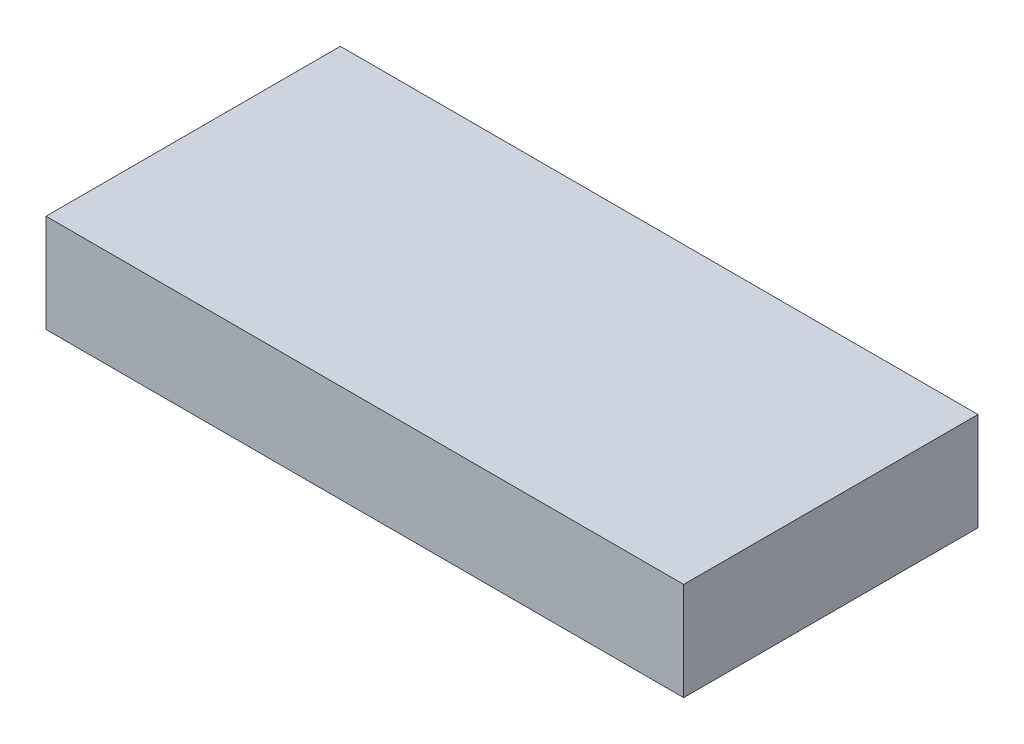
ISO-10303-21;
HEADER;
FILE_DESCRIPTION(('STEP AP214'),'2;1');
FILE_NAME('part.step','',(''),(''),'','','');
FILE_SCHEMA(('AUTOMOTIVE_DESIGN { 1 0 10303 214 1 1 1 1 }'));
ENDSEC;
DATA;
#1=APPLICATION_CONTEXT('core data for automotive mechanical design processes');
#2=APPLICATION_PROTOCOL_DEFINITION('international standard','automotive_design',2000,#1);
#3=PRODUCT_CONTEXT('',#1,'mechanical');
#4=PRODUCT('Part','Part','',(#3));
#5=PRODUCT_RELATED_PRODUCT_CATEGORY('part','',(#4));
#6=PRODUCT_DEFINITION_FORMATION('','',#4);
#7=PRODUCT_DEFINITION_CONTEXT('part definition',#1,'design');
#8=PRODUCT_DEFINITION('design','',#6,#7);
#9=PRODUCT_DEFINITION_SHAPE('','',#8);
#10=(LENGTH_UNIT() NAMED_UNIT(*) SI_UNIT(.MILLI.,.METRE.));
#11=(NAMED_UNIT(*) PLANE_ANGLE_UNIT() SI_UNIT($,.RADIAN.));
#12=(NAMED_UNIT(*) SI_UNIT($,.STERADIAN.) SOLID_ANGLE_UNIT());
#13=UNCERTAINTY_MEASURE_WITH_UNIT(LENGTH_MEASURE(1.E-05),#10,'distance_accuracy_value','');
#14=(GEOMETRIC_REPRESENTATION_CONTEXT(3) GLOBAL_UNCERTAINTY_ASSIGNED_CONTEXT((#13)) GLOBAL_UNIT_ASSIGNED_CONTEXT((#10,
#11,#12)) REPRESENTATION_CONTEXT('',''));
#15=CARTESIAN_POINT('',(0.,0.,0.));
#16=DIRECTION('',(0.,0.,1.));
#17=DIRECTION('',(1.,0.,0.));
#18=AXIS2_PLACEMENT_3D('',#15,#16,#17);
#19=CARTESIAN_POINT('',(-6.5,2.,3.));
#20=DIRECTION('',(0.,0.,-1.));
#21=DIRECTION('',(-1.,0.,0.));
#22=AXIS2_PLACEMENT_3D('',#19,#20,#21);
#23=PLANE('',#22);
#24=DIRECTION('',(1.,0.,0.));
#25=VECTOR('',#24,1.);
#26=CARTESIAN_POINT('',(-6.5,0.,3.));
#27=LINE('',#26,#25);
#28=CARTESIAN_POINT('',(-6.5,0.,3.));
#29=VERTEX_POINT('',#28);
#30=CARTESIAN_POINT('',(6.5,0.,3.));
#31=VERTEX_POINT('',#30);
#32=EDGE_CURVE('E101',#29,#31,#27,.T.);
#33=ORIENTED_EDGE('',*,*,#32,.T.);
#34=DIRECTION('',(0.,-1.,0.));
#35=VECTOR('',#34,1.);
#36=CARTESIAN_POINT('',(6.5,2.,3.));
#37=LINE('',#36,#35);
#38=CARTESIAN_POINT('',(6.5,2.,3.));
#39=VERTEX_POINT('',#38);
#40=EDGE_CURVE('E11',#39,#31,#37,.T.);
#41=ORIENTED_EDGE('',*,*,#40,.F.);
#42=DIRECTION('',(1.,0.,0.));
#43=VECTOR('',#42,1.);
#44=CARTESIAN_POINT('',(-6.5,2.,3.));
#45=LINE('',#44,#43);
#46=CARTESIAN_POINT('',(-6.5,2.,3.));
#47=VERTEX_POINT('',#46);
#48=EDGE_CURVE('E78',#47,#39,#45,.T.);
#49=ORIENTED_EDGE('',*,*,#48,.F.);
#50=DIRECTION('',(0.,-1.,0.));
#51=VECTOR('',#50,1.);
#52=CARTESIAN_POINT('',(-6.5,2.,3.));
#53=LINE('',#52,#51);
#54=EDGE_CURVE('E97',#47,#29,#53,.T.);
#55=ORIENTED_EDGE('',*,*,#54,.T.);
#56=EDGE_LOOP('',(#33,#41,#49,#55));
#57=FACE_BOUND('',#56,.T.);
#58=ADVANCED_FACE('F39',(#57),#23,.F.);
#59=CARTESIAN_POINT('',(6.5,2.,-3.));
#60=DIRECTION('',(1.,0.,0.));
#61=DIRECTION('',(0.,0.,-1.));
#62=AXIS2_PLACEMENT_3D('',#59,#60,#61);
#63=PLANE('',#62);
#64=DIRECTION('',(0.,0.,1.));
#65=VECTOR('',#64,1.);
#66=CARTESIAN_POINT('',(6.5,0.,-3.));
#67=LINE('',#66,#65);
#68=CARTESIAN_POINT('',(6.5,0.,-3.));
#69=VERTEX_POINT('',#68);
#70=EDGE_CURVE('E87',#69,#31,#67,.T.);
#71=ORIENTED_EDGE('',*,*,#70,.F.);
#72=DIRECTION('',(0.,-1.,0.));
#73=VECTOR('',#72,1.);
#74=CARTESIAN_POINT('',(6.5,2.,-3.));
#75=LINE('',#74,#73);
#76=CARTESIAN_POINT('',(6.5,2.,-3.));
#77=VERTEX_POINT('',#76);
#78=EDGE_CURVE('E47',#77,#69,#75,.T.);
#79=ORIENTED_EDGE('',*,*,#78,.F.);
#80=DIRECTION('',(0.,0.,1.));
#81=VECTOR('',#80,1.);
#82=CARTESIAN_POINT('',(6.5,2.,-3.));
#83=LINE('',#82,#81);
#84=EDGE_CURVE('E85',#77,#39,#83,.T.);
#85=ORIENTED_EDGE('',*,*,#84,.T.);
#86=ORIENTED_EDGE('',*,*,#40,.T.);
#87=EDGE_LOOP('',(#71,#79,#85,#86));
#88=FACE_BOUND('',#87,.T.);
#89=ADVANCED_FACE('F84',(#88),#63,.T.);
#90=CARTESIAN_POINT('',(-6.5,2.,-3.));
#91=DIRECTION('',(0.,0.,-1.));
#92=DIRECTION('',(-1.,0.,0.));
#93=AXIS2_PLACEMENT_3D('',#90,#91,#92);
#94=PLANE('',#93);
#95=DIRECTION('',(1.,0.,0.));
#96=VECTOR('',#95,1.);
#97=CARTESIAN_POINT('',(-6.5,0.,-3.));
#98=LINE('',#97,#96);
#99=CARTESIAN_POINT('',(-6.5,0.,-3.));
#100=VERTEX_POINT('',#99);
#101=EDGE_CURVE('E105',#100,#69,#98,.T.);
#102=ORIENTED_EDGE('',*,*,#101,.F.);
#103=DIRECTION('',(0.,-1.,0.));
#104=VECTOR('',#103,1.);
#105=CARTESIAN_POINT('',(-6.5,2.,-3.));
#106=LINE('',#105,#104);
#107=CARTESIAN_POINT('',(-6.5,2.,-3.));
#108=VERTEX_POINT('',#107);
#109=EDGE_CURVE('E70',#108,#100,#106,.T.);
#110=ORIENTED_EDGE('',*,*,#109,.F.);
#111=DIRECTION('',(1.,0.,0.));
#112=VECTOR('',#111,1.);
#113=CARTESIAN_POINT('',(-6.5,2.,-3.));
#114=LINE('',#113,#112);
#115=EDGE_CURVE('E93',#108,#77,#114,.T.);
#116=ORIENTED_EDGE('',*,*,#115,.T.);
#117=ORIENTED_EDGE('',*,*,#78,.T.);
#118=EDGE_LOOP('',(#102,#110,#116,#117));
#119=FACE_BOUND('',#118,.T.);
#120=ADVANCED_FACE('F95',(#119),#94,.T.);
#121=CARTESIAN_POINT('',(-6.5,2.,-3.));
#122=DIRECTION('',(1.,0.,0.));
#123=DIRECTION('',(0.,0.,-1.));
#124=AXIS2_PLACEMENT_3D('',#121,#122,#123);
#125=PLANE('',#124);
#126=DIRECTION('',(0.,0.,1.));
#127=VECTOR('',#126,1.);
#128=CARTESIAN_POINT('',(-6.5,0.,-3.));
#129=LINE('',#128,#127);
#130=EDGE_CURVE('E73',#100,#29,#129,.T.);
#131=ORIENTED_EDGE('',*,*,#130,.T.);
#132=ORIENTED_EDGE('',*,*,#54,.F.);
#133=DIRECTION('',(0.,0.,1.));
#134=VECTOR('',#133,1.);
#135=CARTESIAN_POINT('',(-6.5,2.,-3.));
#136=LINE('',#135,#134);
#137=EDGE_CURVE('E55',#108,#47,#136,.T.);
#138=ORIENTED_EDGE('',*,*,#137,.F.);
#139=ORIENTED_EDGE('',*,*,#109,.T.);
#140=EDGE_LOOP('',(#131,#132,#138,#139));
#141=FACE_BOUND('',#140,.T.);
#142=ADVANCED_FACE('F118',(#141),#125,.F.);
#143=CARTESIAN_POINT('',(0.,2.,0.));
#144=DIRECTION('',(0.,-1.,0.));
#145=DIRECTION('',(0.,0.,-1.));
#146=AXIS2_PLACEMENT_3D('',#143,#144,#145);
#147=PLANE('',#146);
#148=ORIENTED_EDGE('',*,*,#48,.T.);
#149=ORIENTED_EDGE('',*,*,#84,.F.);
#150=ORIENTED_EDGE('',*,*,#115,.F.);
#151=ORIENTED_EDGE('',*,*,#137,.T.);
#152=EDGE_LOOP('',(#148,#149,#150,#151));
#153=FACE_BOUND('',#152,.T.);
#154=ADVANCED_FACE('F92',(#153),#147,.F.);
#155=CARTESIAN_POINT('',(0.,0.,0.));
#156=DIRECTION('',(0.,-1.,0.));
#157=DIRECTION('',(0.,0.,-1.));
#158=AXIS2_PLACEMENT_3D('',#155,#156,#157);
#159=PLANE('',#158);
#160=ORIENTED_EDGE('',*,*,#32,.F.);
#161=ORIENTED_EDGE('',*,*,#130,.F.);
#162=ORIENTED_EDGE('',*,*,#101,.T.);
#163=ORIENTED_EDGE('',*,*,#70,.T.);
#164=EDGE_LOOP('',(#160,#161,#162,#163));
#165=FACE_BOUND('',#164,.T.);
#166=ADVANCED_FACE('F112',(#165),#159,.T.);
#167=CLOSED_SHELL('',(#58,#89,#120,#142,#154,#166));
#168=MANIFOLD_SOLID_BREP('B2',#167);
#169=ADVANCED_BREP_SHAPE_REPRESENTATION('',(#18,#168),#14);
#170=SHAPE_DEFINITION_REPRESENTATION(#9,#169);
ENDSEC;
END-ISO-10303-21;
